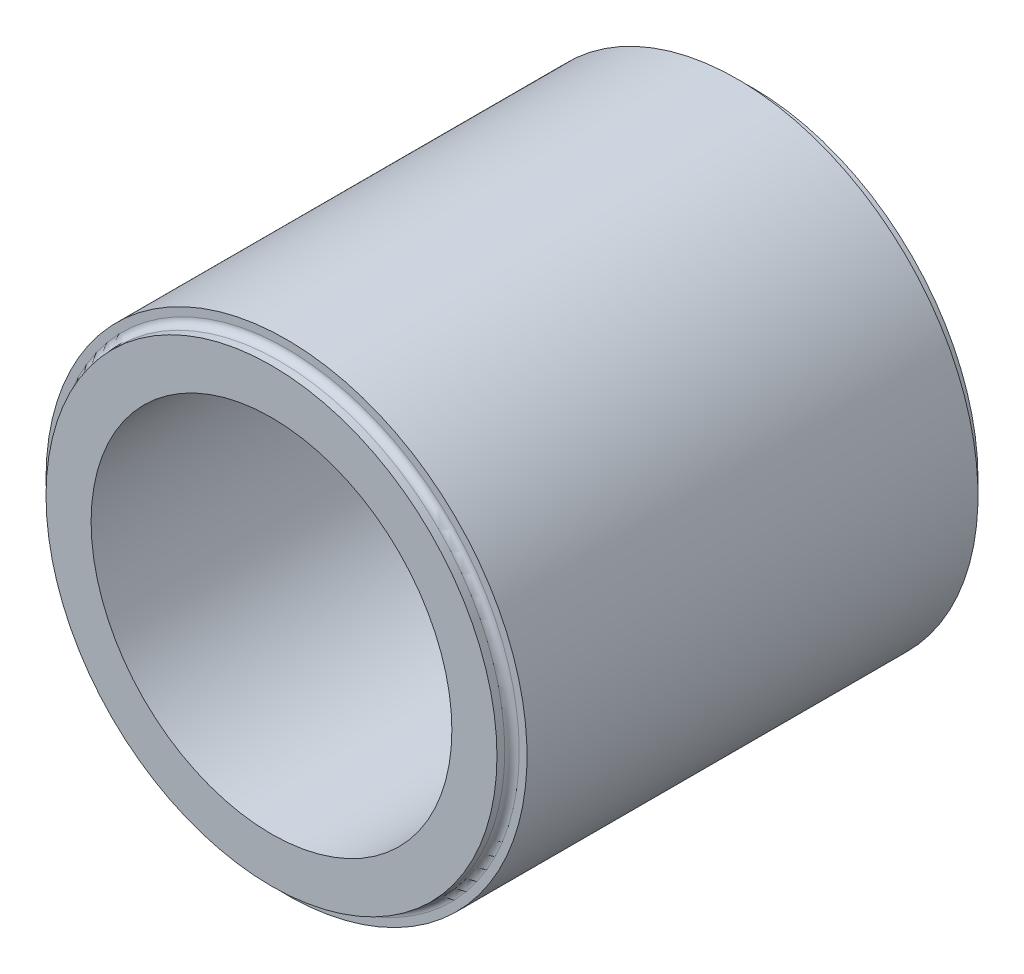
ISO-10303-21;
HEADER;
FILE_DESCRIPTION(('STEP AP214'),'2;1');
FILE_NAME('part.step','',(''),(''),'','','');
FILE_SCHEMA(('AUTOMOTIVE_DESIGN { 1 0 10303 214 1 1 1 1 }'));
ENDSEC;
DATA;
#1=APPLICATION_CONTEXT('core data for automotive mechanical design processes');
#2=APPLICATION_PROTOCOL_DEFINITION('international standard','automotive_design',2000,#1);
#3=PRODUCT_CONTEXT('',#1,'mechanical');
#4=PRODUCT('Part','Part','',(#3));
#5=PRODUCT_RELATED_PRODUCT_CATEGORY('part','',(#4));
#6=PRODUCT_DEFINITION_FORMATION('','',#4);
#7=PRODUCT_DEFINITION_CONTEXT('part definition',#1,'design');
#8=PRODUCT_DEFINITION('design','',#6,#7);
#9=PRODUCT_DEFINITION_SHAPE('','',#8);
#10=(LENGTH_UNIT() NAMED_UNIT(*) SI_UNIT(.MILLI.,.METRE.));
#11=(NAMED_UNIT(*) PLANE_ANGLE_UNIT() SI_UNIT($,.RADIAN.));
#12=(NAMED_UNIT(*) SI_UNIT($,.STERADIAN.) SOLID_ANGLE_UNIT());
#13=UNCERTAINTY_MEASURE_WITH_UNIT(LENGTH_MEASURE(1.E-05),#10,'distance_accuracy_value','');
#14=(GEOMETRIC_REPRESENTATION_CONTEXT(3) GLOBAL_UNCERTAINTY_ASSIGNED_CONTEXT((#13)) GLOBAL_UNIT_ASSIGNED_CONTEXT((#10,
#11,#12)) REPRESENTATION_CONTEXT('',''));
#15=CARTESIAN_POINT('',(0.,0.,0.));
#16=DIRECTION('',(0.,0.,1.));
#17=DIRECTION('',(1.,0.,0.));
#18=AXIS2_PLACEMENT_3D('',#15,#16,#17);
#19=CARTESIAN_POINT('',(0.,0.,50.8));
#20=DIRECTION('',(0.,0.,-1.));
#21=DIRECTION('',(-1.,0.,0.));
#22=AXIS2_PLACEMENT_3D('',#19,#20,#21);
#23=CYLINDRICAL_SURFACE('',#22,25.4);
#24=CARTESIAN_POINT('',(0.,0.,1.5875));
#25=DIRECTION('',(0.,0.,-1.));
#26=DIRECTION('',(-1.,0.,0.));
#27=AXIS2_PLACEMENT_3D('',#24,#25,#26);
#28=CIRCLE('',#27,25.4);
#29=CARTESIAN_POINT('',(-25.4,0.,1.5875));
#30=VERTEX_POINT('',#29);
#31=EDGE_CURVE('E57',#30,#30,#28,.T.);
#32=ORIENTED_EDGE('',*,*,#31,.F.);
#33=EDGE_LOOP('',(#32));
#34=FACE_BOUND('',#33,.T.);
#35=CARTESIAN_POINT('',(0.,0.,49.2125));
#36=DIRECTION('',(0.,0.,-1.));
#37=DIRECTION('',(-1.,0.,0.));
#38=AXIS2_PLACEMENT_3D('',#35,#36,#37);
#39=CIRCLE('',#38,25.4);
#40=CARTESIAN_POINT('',(-25.4,0.,49.2125));
#41=VERTEX_POINT('',#40);
#42=EDGE_CURVE('E65',#41,#41,#39,.T.);
#43=ORIENTED_EDGE('',*,*,#42,.T.);
#44=EDGE_LOOP('',(#43));
#45=FACE_BOUND('',#44,.T.);
#46=ADVANCED_FACE('F33',(#34,#45),#23,.T.);
#47=CARTESIAN_POINT('',(0.,0.,50.8));
#48=DIRECTION('',(0.,0.,1.));
#49=DIRECTION('',(1.,0.,0.));
#50=AXIS2_PLACEMENT_3D('',#47,#48,#49);
#51=PLANE('',#50);
#52=CARTESIAN_POINT('',(0.,0.,50.8));
#53=DIRECTION('',(0.,0.,1.));
#54=DIRECTION('',(1.,0.,0.));
#55=AXIS2_PLACEMENT_3D('',#52,#53,#54);
#56=CIRCLE('',#55,19.05);
#57=CARTESIAN_POINT('',(19.05,0.,50.8));
#58=VERTEX_POINT('',#57);
#59=EDGE_CURVE('E53',#58,#58,#56,.T.);
#60=ORIENTED_EDGE('',*,*,#59,.F.);
#61=EDGE_LOOP('',(#60));
#62=FACE_BOUND('',#61,.T.);
#63=CARTESIAN_POINT('',(0.,0.,50.8));
#64=DIRECTION('',(0.,0.,-1.));
#65=DIRECTION('',(-1.,0.,0.));
#66=AXIS2_PLACEMENT_3D('',#63,#64,#65);
#67=CIRCLE('',#66,23.8125);
#68=CARTESIAN_POINT('',(-23.8125,0.,50.8));
#69=VERTEX_POINT('',#68);
#70=EDGE_CURVE('E68',#69,#69,#67,.T.);
#71=ORIENTED_EDGE('',*,*,#70,.F.);
#72=EDGE_LOOP('',(#71));
#73=FACE_BOUND('',#72,.T.);
#74=ADVANCED_FACE('F74',(#62,#73),#51,.T.);
#75=CARTESIAN_POINT('',(0.,0.,0.));
#76=DIRECTION('',(0.,0.,1.));
#77=DIRECTION('',(1.,0.,0.));
#78=AXIS2_PLACEMENT_3D('',#75,#76,#77);
#79=PLANE('',#78);
#80=CARTESIAN_POINT('',(0.,0.,0.));
#81=DIRECTION('',(0.,0.,1.));
#82=DIRECTION('',(1.,0.,0.));
#83=AXIS2_PLACEMENT_3D('',#80,#81,#82);
#84=CIRCLE('',#83,19.05);
#85=CARTESIAN_POINT('',(19.05,0.,0.));
#86=VERTEX_POINT('',#85);
#87=EDGE_CURVE('E54',#86,#86,#84,.T.);
#88=ORIENTED_EDGE('',*,*,#87,.T.);
#89=EDGE_LOOP('',(#88));
#90=FACE_BOUND('',#89,.T.);
#91=CARTESIAN_POINT('',(0.,0.,0.));
#92=DIRECTION('',(0.,0.,-1.));
#93=DIRECTION('',(-1.,0.,0.));
#94=AXIS2_PLACEMENT_3D('',#91,#92,#93);
#95=CIRCLE('',#94,23.8125);
#96=CARTESIAN_POINT('',(-23.8125,0.,0.));
#97=VERTEX_POINT('',#96);
#98=EDGE_CURVE('E62',#97,#97,#95,.T.);
#99=ORIENTED_EDGE('',*,*,#98,.T.);
#100=EDGE_LOOP('',(#99));
#101=FACE_BOUND('',#100,.T.);
#102=ADVANCED_FACE('F76',(#90,#101),#79,.F.);
#103=CARTESIAN_POINT('',(0.,0.,50.8));
#104=DIRECTION('',(0.,0.,-1.));
#105=DIRECTION('',(-1.,0.,0.));
#106=AXIS2_PLACEMENT_3D('',#103,#104,#105);
#107=CYLINDRICAL_SURFACE('',#106,19.05);
#108=ORIENTED_EDGE('',*,*,#59,.T.);
#109=EDGE_LOOP('',(#108));
#110=FACE_BOUND('',#109,.T.);
#111=ORIENTED_EDGE('',*,*,#87,.F.);
#112=EDGE_LOOP('',(#111));
#113=FACE_BOUND('',#112,.T.);
#114=ADVANCED_FACE('F84',(#110,#113),#107,.F.);
#115=CARTESIAN_POINT('',(0.,0.,1.5875));
#116=DIRECTION('',(0.,0.,-1.));
#117=DIRECTION('',(-1.,0.,0.));
#118=AXIS2_PLACEMENT_3D('',#115,#116,#117);
#119=PLANE('',#118);
#120=CARTESIAN_POINT('',(0.,0.,1.5875));
#121=DIRECTION('',(0.,0.,-1.));
#122=DIRECTION('',(-1.,0.,0.));
#123=AXIS2_PLACEMENT_3D('',#120,#121,#122);
#124=CIRCLE('',#123,24.5745);
#125=CARTESIAN_POINT('',(-24.5745,0.,1.5875));
#126=VERTEX_POINT('',#125);
#127=EDGE_CURVE('E44',#126,#126,#124,.F.);
#128=ORIENTED_EDGE('',*,*,#127,.T.);
#129=EDGE_LOOP('',(#128));
#130=FACE_BOUND('',#129,.T.);
#131=ORIENTED_EDGE('',*,*,#31,.T.);
#132=EDGE_LOOP('',(#131));
#133=FACE_BOUND('',#132,.T.);
#134=ADVANCED_FACE('F110',(#130,#133),#119,.T.);
#135=CARTESIAN_POINT('',(0.,0.,1.5875));
#136=DIRECTION('',(0.,0.,-1.));
#137=DIRECTION('',(-1.,0.,0.));
#138=AXIS2_PLACEMENT_3D('',#135,#136,#137);
#139=CYLINDRICAL_SURFACE('',#138,23.8125);
#140=CARTESIAN_POINT('',(0.,0.,0.8255));
#141=DIRECTION('',(0.,0.,-1.));
#142=DIRECTION('',(-1.,0.,0.));
#143=AXIS2_PLACEMENT_3D('',#140,#141,#142);
#144=CIRCLE('',#143,23.8125);
#145=CARTESIAN_POINT('',(-23.8125,0.,0.8255));
#146=VERTEX_POINT('',#145);
#147=EDGE_CURVE('E48',#146,#146,#144,.T.);
#148=ORIENTED_EDGE('',*,*,#147,.T.);
#149=EDGE_LOOP('',(#148));
#150=FACE_BOUND('',#149,.T.);
#151=ORIENTED_EDGE('',*,*,#98,.F.);
#152=EDGE_LOOP('',(#151));
#153=FACE_BOUND('',#152,.T.);
#154=ADVANCED_FACE('F107',(#150,#153),#139,.T.);
#155=CARTESIAN_POINT('',(0.,0.,49.2125));
#156=DIRECTION('',(0.,0.,1.));
#157=DIRECTION('',(-1.,0.,0.));
#158=AXIS2_PLACEMENT_3D('',#155,#156,#157);
#159=PLANE('',#158);
#160=CARTESIAN_POINT('',(0.,0.,49.2125));
#161=DIRECTION('',(0.,0.,1.));
#162=DIRECTION('',(1.,0.,0.));
#163=AXIS2_PLACEMENT_3D('',#160,#161,#162);
#164=CIRCLE('',#163,24.5745);
#165=CARTESIAN_POINT('',(24.5745,0.,49.2125));
#166=VERTEX_POINT('',#165);
#167=EDGE_CURVE('E40',#166,#166,#164,.F.);
#168=ORIENTED_EDGE('',*,*,#167,.T.);
#169=EDGE_LOOP('',(#168));
#170=FACE_BOUND('',#169,.T.);
#171=ORIENTED_EDGE('',*,*,#42,.F.);
#172=EDGE_LOOP('',(#171));
#173=FACE_BOUND('',#172,.T.);
#174=ADVANCED_FACE('F101',(#170,#173),#159,.T.);
#175=CARTESIAN_POINT('',(0.,0.,49.2125));
#176=DIRECTION('',(0.,0.,1.));
#177=DIRECTION('',(1.,0.,0.));
#178=AXIS2_PLACEMENT_3D('',#175,#176,#177);
#179=CYLINDRICAL_SURFACE('',#178,23.8125);
#180=CARTESIAN_POINT('',(0.,0.,49.9745));
#181=DIRECTION('',(0.,0.,1.));
#182=DIRECTION('',(1.,0.,0.));
#183=AXIS2_PLACEMENT_3D('',#180,#181,#182);
#184=CIRCLE('',#183,23.8125);
#185=CARTESIAN_POINT('',(23.8125,0.,49.9745));
#186=VERTEX_POINT('',#185);
#187=EDGE_CURVE('E10',#186,#186,#184,.T.);
#188=ORIENTED_EDGE('',*,*,#187,.T.);
#189=EDGE_LOOP('',(#188));
#190=FACE_BOUND('',#189,.T.);
#191=ORIENTED_EDGE('',*,*,#70,.T.);
#192=EDGE_LOOP('',(#191));
#193=FACE_BOUND('',#192,.T.);
#194=ADVANCED_FACE('F72',(#190,#193),#179,.T.);
#195=CARTESIAN_POINT('',(0.,0.,0.8255));
#196=DIRECTION('',(0.,0.,-1.));
#197=DIRECTION('',(-1.,0.,0.));
#198=AXIS2_PLACEMENT_3D('',#195,#196,#197);
#199=TOROIDAL_SURFACE('',#198,24.5745,0.762);
#200=ORIENTED_EDGE('',*,*,#127,.F.);
#201=EDGE_LOOP('',(#200));
#202=FACE_BOUND('',#201,.T.);
#203=ORIENTED_EDGE('',*,*,#147,.F.);
#204=EDGE_LOOP('',(#203));
#205=FACE_BOUND('',#204,.T.);
#206=ADVANCED_FACE('F92',(#202,#205),#199,.F.);
#207=CARTESIAN_POINT('',(0.,0.,49.9745));
#208=DIRECTION('',(0.,0.,1.));
#209=DIRECTION('',(1.,0.,0.));
#210=AXIS2_PLACEMENT_3D('',#207,#208,#209);
#211=TOROIDAL_SURFACE('',#210,24.5745,0.762);
#212=ORIENTED_EDGE('',*,*,#187,.F.);
#213=EDGE_LOOP('',(#212));
#214=FACE_BOUND('',#213,.T.);
#215=ORIENTED_EDGE('',*,*,#167,.F.);
#216=EDGE_LOOP('',(#215));
#217=FACE_BOUND('',#216,.T.);
#218=ADVANCED_FACE('F35',(#214,#217),#211,.F.);
#219=CLOSED_SHELL('',(#46,#74,#102,#114,#134,#154,#174,#194,#206,#218));
#220=MANIFOLD_SOLID_BREP('B2',#219);
#221=ADVANCED_BREP_SHAPE_REPRESENTATION('',(#18,#220),#14);
#222=SHAPE_DEFINITION_REPRESENTATION(#9,#221);
ENDSEC;
END-ISO-10303-21;
